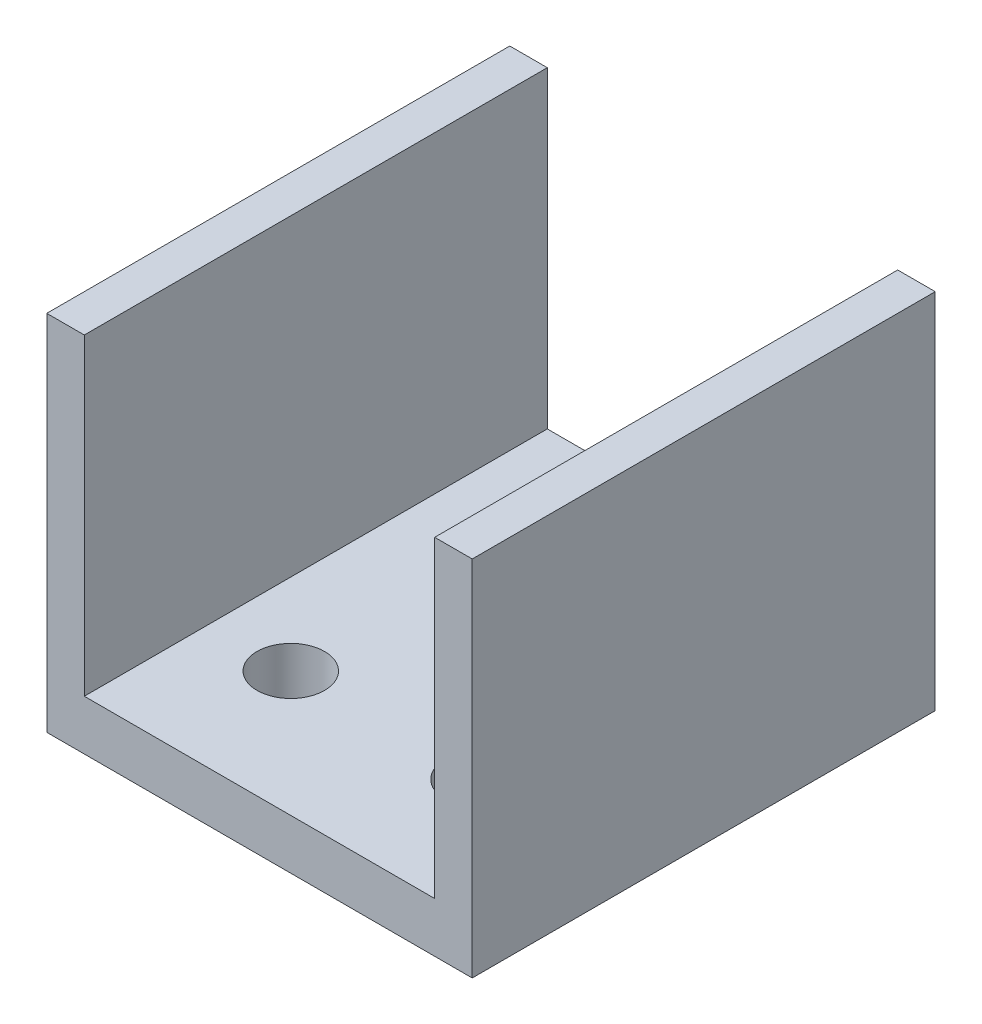
ISO-10303-21;
HEADER;
FILE_DESCRIPTION(('STEP AP214'),'2;1');
FILE_NAME('part.step','',(''),(''),'','','');
FILE_SCHEMA(('AUTOMOTIVE_DESIGN { 1 0 10303 214 1 1 1 1 }'));
ENDSEC;
DATA;
#1=APPLICATION_CONTEXT('core data for automotive mechanical design processes');
#2=APPLICATION_PROTOCOL_DEFINITION('international standard','automotive_design',2000,#1);
#3=PRODUCT_CONTEXT('',#1,'mechanical');
#4=PRODUCT('Part','Part','',(#3));
#5=PRODUCT_RELATED_PRODUCT_CATEGORY('part','',(#4));
#6=PRODUCT_DEFINITION_FORMATION('','',#4);
#7=PRODUCT_DEFINITION_CONTEXT('part definition',#1,'design');
#8=PRODUCT_DEFINITION('design','',#6,#7);
#9=PRODUCT_DEFINITION_SHAPE('','',#8);
#10=(LENGTH_UNIT() NAMED_UNIT(*) SI_UNIT(.MILLI.,.METRE.));
#11=(NAMED_UNIT(*) PLANE_ANGLE_UNIT() SI_UNIT($,.RADIAN.));
#12=(NAMED_UNIT(*) SI_UNIT($,.STERADIAN.) SOLID_ANGLE_UNIT());
#13=UNCERTAINTY_MEASURE_WITH_UNIT(LENGTH_MEASURE(1.E-05),#10,'distance_accuracy_value','');
#14=(GEOMETRIC_REPRESENTATION_CONTEXT(3) GLOBAL_UNCERTAINTY_ASSIGNED_CONTEXT((#13)) GLOBAL_UNIT_ASSIGNED_CONTEXT((#10,
#11,#12)) REPRESENTATION_CONTEXT('',''));
#15=CARTESIAN_POINT('',(0.,0.,0.));
#16=DIRECTION('',(0.,0.,1.));
#17=DIRECTION('',(1.,0.,0.));
#18=AXIS2_PLACEMENT_3D('',#15,#16,#17);
#19=CARTESIAN_POINT('',(0.,4.,0.));
#20=DIRECTION('',(0.,-1.,0.));
#21=DIRECTION('',(0.,0.,-1.));
#22=AXIS2_PLACEMENT_3D('',#19,#20,#21);
#23=PLANE('',#22);
#24=CARTESIAN_POINT('',(-26.3253908026687,4.,-0.924231459172718));
#25=DIRECTION('',(0.,1.,0.));
#26=DIRECTION('',(0.,0.,-1.));
#27=AXIS2_PLACEMENT_3D('',#24,#25,#26);
#28=CIRCLE('',#27,2.7);
#29=CARTESIAN_POINT('',(-26.3253908026687,4.,-3.62423145917272));
#30=VERTEX_POINT('',#29);
#31=EDGE_CURVE('E152',#30,#30,#28,.T.);
#32=ORIENTED_EDGE('',*,*,#31,.F.);
#33=EDGE_LOOP('',(#32));
#34=FACE_BOUND('',#33,.T.);
#35=CARTESIAN_POINT('',(-11.3253908026687,4.,-0.92423145917272));
#36=DIRECTION('',(0.,1.,0.));
#37=DIRECTION('',(0.,0.,1.));
#38=AXIS2_PLACEMENT_3D('',#35,#36,#37);
#39=CIRCLE('',#38,2.7);
#40=CARTESIAN_POINT('',(-11.3253908026687,4.,1.77576854082728));
#41=VERTEX_POINT('',#40);
#42=EDGE_CURVE('E158',#41,#41,#39,.T.);
#43=ORIENTED_EDGE('',*,*,#42,.F.);
#44=EDGE_LOOP('',(#43));
#45=FACE_BOUND('',#44,.T.);
#46=CARTESIAN_POINT('',(-18.8253908026687,4.,-20.9242314591727));
#47=DIRECTION('',(0.,1.,0.));
#48=DIRECTION('',(0.,0.,1.));
#49=AXIS2_PLACEMENT_3D('',#46,#47,#48);
#50=CIRCLE('',#49,2.7);
#51=CARTESIAN_POINT('',(-18.8253908026687,4.,-18.2242314591727));
#52=VERTEX_POINT('',#51);
#53=EDGE_CURVE('E164',#52,#52,#50,.T.);
#54=ORIENTED_EDGE('',*,*,#53,.F.);
#55=EDGE_LOOP('',(#54));
#56=FACE_BOUND('',#55,.T.);
#57=DIRECTION('',(0.,0.,-1.));
#58=VECTOR('',#57,1.);
#59=CARTESIAN_POINT('',(-4.82539080266867,4.,-27.9242314591727));
#60=LINE('',#59,#58);
#61=CARTESIAN_POINT('',(-4.82539080266867,4.,9.07576854082728));
#62=VERTEX_POINT('',#61);
#63=CARTESIAN_POINT('',(-4.82539080266867,4.,-27.9242314591727));
#64=VERTEX_POINT('',#63);
#65=EDGE_CURVE('E115',#62,#64,#60,.T.);
#66=ORIENTED_EDGE('',*,*,#65,.T.);
#67=DIRECTION('',(-1.,0.,0.));
#68=VECTOR('',#67,1.);
#69=CARTESIAN_POINT('',(-35.8253908026687,4.,-27.9242314591727));
#70=LINE('',#69,#68);
#71=CARTESIAN_POINT('',(-32.8253908026687,4.,-27.9242314591727));
#72=VERTEX_POINT('',#71);
#73=EDGE_CURVE('E127',#64,#72,#70,.T.);
#74=ORIENTED_EDGE('',*,*,#73,.T.);
#75=DIRECTION('',(0.,0.,1.));
#76=VECTOR('',#75,1.);
#77=CARTESIAN_POINT('',(-32.8253908026687,4.,9.07576854082728));
#78=LINE('',#77,#76);
#79=CARTESIAN_POINT('',(-32.8253908026687,4.,9.07576854082728));
#80=VERTEX_POINT('',#79);
#81=EDGE_CURVE('E141',#72,#80,#78,.T.);
#82=ORIENTED_EDGE('',*,*,#81,.T.);
#83=DIRECTION('',(1.,0.,0.));
#84=VECTOR('',#83,1.);
#85=CARTESIAN_POINT('',(-35.8253908026687,4.,9.07576854082728));
#86=LINE('',#85,#84);
#87=EDGE_CURVE('E50',#80,#62,#86,.T.);
#88=ORIENTED_EDGE('',*,*,#87,.T.);
#89=EDGE_LOOP('',(#66,#74,#82,#88));
#90=FACE_BOUND('',#89,.T.);
#91=ADVANCED_FACE('F35',(#34,#45,#56,#90),#23,.F.);
#92=CARTESIAN_POINT('',(0.,0.,0.));
#93=DIRECTION('',(0.,-1.,0.));
#94=DIRECTION('',(0.,0.,-1.));
#95=AXIS2_PLACEMENT_3D('',#92,#93,#94);
#96=PLANE('',#95);
#97=CARTESIAN_POINT('',(-11.3253908026687,0.,-0.92423145917272));
#98=DIRECTION('',(0.,1.,0.));
#99=DIRECTION('',(0.,0.,1.));
#100=AXIS2_PLACEMENT_3D('',#97,#98,#99);
#101=CIRCLE('',#100,2.7);
#102=CARTESIAN_POINT('',(-11.3253908026687,0.,1.77576854082728));
#103=VERTEX_POINT('',#102);
#104=EDGE_CURVE('E155',#103,#103,#101,.T.);
#105=ORIENTED_EDGE('',*,*,#104,.T.);
#106=EDGE_LOOP('',(#105));
#107=FACE_BOUND('',#106,.T.);
#108=DIRECTION('',(0.,0.,1.));
#109=VECTOR('',#108,1.);
#110=CARTESIAN_POINT('',(-35.8253908026687,0.,9.07576854082728));
#111=LINE('',#110,#109);
#112=CARTESIAN_POINT('',(-35.8253908026687,0.,-27.9242314591727));
#113=VERTEX_POINT('',#112);
#114=CARTESIAN_POINT('',(-35.8253908026687,0.,9.07576854082728));
#115=VERTEX_POINT('',#114);
#116=EDGE_CURVE('E167',#113,#115,#111,.T.);
#117=ORIENTED_EDGE('',*,*,#116,.F.);
#118=DIRECTION('',(-1.,0.,0.));
#119=VECTOR('',#118,1.);
#120=CARTESIAN_POINT('',(-35.8253908026687,0.,-27.9242314591727));
#121=LINE('',#120,#119);
#122=CARTESIAN_POINT('',(-1.82539080266867,0.,-27.9242314591727));
#123=VERTEX_POINT('',#122);
#124=EDGE_CURVE('E171',#123,#113,#121,.T.);
#125=ORIENTED_EDGE('',*,*,#124,.F.);
#126=DIRECTION('',(0.,0.,-1.));
#127=VECTOR('',#126,1.);
#128=CARTESIAN_POINT('',(-1.82539080266866,0.,9.07576854082728));
#129=LINE('',#128,#127);
#130=CARTESIAN_POINT('',(-1.82539080266866,0.,9.07576854082728));
#131=VERTEX_POINT('',#130);
#132=EDGE_CURVE('E178',#131,#123,#129,.T.);
#133=ORIENTED_EDGE('',*,*,#132,.F.);
#134=DIRECTION('',(1.,0.,0.));
#135=VECTOR('',#134,1.);
#136=CARTESIAN_POINT('',(-35.8253908026687,0.,9.07576854082728));
#137=LINE('',#136,#135);
#138=EDGE_CURVE('E176',#115,#131,#137,.T.);
#139=ORIENTED_EDGE('',*,*,#138,.F.);
#140=EDGE_LOOP('',(#117,#125,#133,#139));
#141=FACE_BOUND('',#140,.T.);
#142=CARTESIAN_POINT('',(-18.8253908026687,0.,-20.9242314591727));
#143=DIRECTION('',(0.,1.,0.));
#144=DIRECTION('',(0.,0.,1.));
#145=AXIS2_PLACEMENT_3D('',#142,#143,#144);
#146=CIRCLE('',#145,2.7);
#147=CARTESIAN_POINT('',(-18.8253908026687,0.,-18.2242314591727));
#148=VERTEX_POINT('',#147);
#149=EDGE_CURVE('E161',#148,#148,#146,.T.);
#150=ORIENTED_EDGE('',*,*,#149,.T.);
#151=EDGE_LOOP('',(#150));
#152=FACE_BOUND('',#151,.T.);
#153=CARTESIAN_POINT('',(-26.3253908026687,0.,-0.924231459172718));
#154=DIRECTION('',(0.,1.,0.));
#155=DIRECTION('',(0.,0.,-1.));
#156=AXIS2_PLACEMENT_3D('',#153,#154,#155);
#157=CIRCLE('',#156,2.7);
#158=CARTESIAN_POINT('',(-26.3253908026687,0.,-3.62423145917272));
#159=VERTEX_POINT('',#158);
#160=EDGE_CURVE('E149',#159,#159,#157,.T.);
#161=ORIENTED_EDGE('',*,*,#160,.T.);
#162=EDGE_LOOP('',(#161));
#163=FACE_BOUND('',#162,.T.);
#164=ADVANCED_FACE('F192',(#107,#141,#152,#163),#96,.T.);
#165=CARTESIAN_POINT('',(-35.8253908026687,4.,9.07576854082728));
#166=DIRECTION('',(1.,0.,0.));
#167=DIRECTION('',(0.,0.,-1.));
#168=AXIS2_PLACEMENT_3D('',#165,#166,#167);
#169=PLANE('',#168);
#170=ORIENTED_EDGE('',*,*,#116,.T.);
#171=DIRECTION('',(0.,-1.,0.));
#172=VECTOR('',#171,1.);
#173=CARTESIAN_POINT('',(-35.8253908026687,4.,9.07576854082728));
#174=LINE('',#173,#172);
#175=CARTESIAN_POINT('',(-35.8253908026687,29.,9.07576854082728));
#176=VERTEX_POINT('',#175);
#177=EDGE_CURVE('E11',#176,#115,#174,.T.);
#178=ORIENTED_EDGE('',*,*,#177,.F.);
#179=DIRECTION('',(0.,0.,-1.));
#180=VECTOR('',#179,1.);
#181=CARTESIAN_POINT('',(-35.8253908026687,29.,9.07576854082728));
#182=LINE('',#181,#180);
#183=CARTESIAN_POINT('',(-35.8253908026687,29.,-27.9242314591727));
#184=VERTEX_POINT('',#183);
#185=EDGE_CURVE('E133',#176,#184,#182,.T.);
#186=ORIENTED_EDGE('',*,*,#185,.T.);
#187=DIRECTION('',(0.,-1.,0.));
#188=VECTOR('',#187,1.);
#189=CARTESIAN_POINT('',(-35.8253908026687,4.,-27.9242314591727));
#190=LINE('',#189,#188);
#191=EDGE_CURVE('E173',#184,#113,#190,.T.);
#192=ORIENTED_EDGE('',*,*,#191,.T.);
#193=EDGE_LOOP('',(#170,#178,#186,#192));
#194=FACE_BOUND('',#193,.T.);
#195=ADVANCED_FACE('F37',(#194),#169,.F.);
#196=CARTESIAN_POINT('',(-35.8253908026687,4.,9.07576854082728));
#197=DIRECTION('',(0.,0.,-1.));
#198=DIRECTION('',(-1.,0.,0.));
#199=AXIS2_PLACEMENT_3D('',#196,#197,#198);
#200=PLANE('',#199);
#201=ORIENTED_EDGE('',*,*,#138,.T.);
#202=DIRECTION('',(0.,-1.,0.));
#203=VECTOR('',#202,1.);
#204=CARTESIAN_POINT('',(-1.82539080266866,4.,9.07576854082728));
#205=LINE('',#204,#203);
#206=CARTESIAN_POINT('',(-1.82539080266866,29.,9.07576854082727));
#207=VERTEX_POINT('',#206);
#208=EDGE_CURVE('E43',#207,#131,#205,.T.);
#209=ORIENTED_EDGE('',*,*,#208,.F.);
#210=DIRECTION('',(1.,0.,0.));
#211=VECTOR('',#210,1.);
#212=CARTESIAN_POINT('',(-4.82539080266866,29.,9.07576854082727));
#213=LINE('',#212,#211);
#214=CARTESIAN_POINT('',(-4.82539080266866,29.,9.07576854082727));
#215=VERTEX_POINT('',#214);
#216=EDGE_CURVE('E114',#215,#207,#213,.T.);
#217=ORIENTED_EDGE('',*,*,#216,.F.);
#218=DIRECTION('',(0.,-1.,0.));
#219=VECTOR('',#218,1.);
#220=CARTESIAN_POINT('',(-4.82539080266866,4.,9.07576854082727));
#221=LINE('',#220,#219);
#222=EDGE_CURVE('E123',#215,#62,#221,.T.);
#223=ORIENTED_EDGE('',*,*,#222,.T.);
#224=ORIENTED_EDGE('',*,*,#87,.F.);
#225=DIRECTION('',(0.,1.,0.));
#226=VECTOR('',#225,1.);
#227=CARTESIAN_POINT('',(-32.8253908026687,4.,9.07576854082728));
#228=LINE('',#227,#226);
#229=CARTESIAN_POINT('',(-32.8253908026687,29.,9.07576854082728));
#230=VERTEX_POINT('',#229);
#231=EDGE_CURVE('E58',#80,#230,#228,.T.);
#232=ORIENTED_EDGE('',*,*,#231,.T.);
#233=DIRECTION('',(-1.,0.,0.));
#234=VECTOR('',#233,1.);
#235=CARTESIAN_POINT('',(-32.8253908026687,29.,9.07576854082728));
#236=LINE('',#235,#234);
#237=EDGE_CURVE('E143',#230,#176,#236,.T.);
#238=ORIENTED_EDGE('',*,*,#237,.T.);
#239=ORIENTED_EDGE('',*,*,#177,.T.);
#240=EDGE_LOOP('',(#201,#209,#217,#223,#224,#232,#238,#239));
#241=FACE_BOUND('',#240,.T.);
#242=ADVANCED_FACE('F200',(#241),#200,.F.);
#243=CARTESIAN_POINT('',(-1.82539080266866,4.,9.07576854082728));
#244=DIRECTION('',(-1.,0.,0.));
#245=DIRECTION('',(0.,0.,1.));
#246=AXIS2_PLACEMENT_3D('',#243,#244,#245);
#247=PLANE('',#246);
#248=ORIENTED_EDGE('',*,*,#132,.T.);
#249=DIRECTION('',(0.,-1.,0.));
#250=VECTOR('',#249,1.);
#251=CARTESIAN_POINT('',(-1.82539080266867,4.,-27.9242314591727));
#252=LINE('',#251,#250);
#253=CARTESIAN_POINT('',(-1.82539080266867,29.,-27.9242314591727));
#254=VERTEX_POINT('',#253);
#255=EDGE_CURVE('E183',#254,#123,#252,.T.);
#256=ORIENTED_EDGE('',*,*,#255,.F.);
#257=DIRECTION('',(0.,0.,1.));
#258=VECTOR('',#257,1.);
#259=CARTESIAN_POINT('',(-1.82539080266867,29.,-27.9242314591727));
#260=LINE('',#259,#258);
#261=EDGE_CURVE('E110',#254,#207,#260,.T.);
#262=ORIENTED_EDGE('',*,*,#261,.T.);
#263=ORIENTED_EDGE('',*,*,#208,.T.);
#264=EDGE_LOOP('',(#248,#256,#262,#263));
#265=FACE_BOUND('',#264,.T.);
#266=ADVANCED_FACE('F187',(#265),#247,.F.);
#267=CARTESIAN_POINT('',(-35.8253908026687,4.,-27.9242314591727));
#268=DIRECTION('',(0.,0.,1.));
#269=DIRECTION('',(1.,0.,0.));
#270=AXIS2_PLACEMENT_3D('',#267,#268,#269);
#271=PLANE('',#270);
#272=ORIENTED_EDGE('',*,*,#124,.T.);
#273=ORIENTED_EDGE('',*,*,#191,.F.);
#274=DIRECTION('',(-1.,0.,0.));
#275=VECTOR('',#274,1.);
#276=CARTESIAN_POINT('',(-32.8253908026687,29.,-27.9242314591727));
#277=LINE('',#276,#275);
#278=CARTESIAN_POINT('',(-32.8253908026687,29.,-27.9242314591727));
#279=VERTEX_POINT('',#278);
#280=EDGE_CURVE('E146',#279,#184,#277,.T.);
#281=ORIENTED_EDGE('',*,*,#280,.F.);
#282=DIRECTION('',(0.,-1.,0.));
#283=VECTOR('',#282,1.);
#284=CARTESIAN_POINT('',(-32.8253908026687,4.,-27.9242314591727));
#285=LINE('',#284,#283);
#286=EDGE_CURVE('E139',#279,#72,#285,.T.);
#287=ORIENTED_EDGE('',*,*,#286,.T.);
#288=ORIENTED_EDGE('',*,*,#73,.F.);
#289=DIRECTION('',(0.,1.,0.));
#290=VECTOR('',#289,1.);
#291=CARTESIAN_POINT('',(-4.82539080266867,4.,-27.9242314591727));
#292=LINE('',#291,#290);
#293=CARTESIAN_POINT('',(-4.82539080266867,29.,-27.9242314591727));
#294=VERTEX_POINT('',#293);
#295=EDGE_CURVE('E122',#64,#294,#292,.T.);
#296=ORIENTED_EDGE('',*,*,#295,.T.);
#297=DIRECTION('',(1.,0.,0.));
#298=VECTOR('',#297,1.);
#299=CARTESIAN_POINT('',(-4.82539080266867,29.,-27.9242314591727));
#300=LINE('',#299,#298);
#301=EDGE_CURVE('E104',#294,#254,#300,.T.);
#302=ORIENTED_EDGE('',*,*,#301,.T.);
#303=ORIENTED_EDGE('',*,*,#255,.T.);
#304=EDGE_LOOP('',(#272,#273,#281,#287,#288,#296,#302,#303));
#305=FACE_BOUND('',#304,.T.);
#306=ADVANCED_FACE('F125',(#305),#271,.F.);
#307=CARTESIAN_POINT('',(-18.8253908026687,4.,-20.9242314591727));
#308=DIRECTION('',(0.,-1.,0.));
#309=DIRECTION('',(0.,0.,-1.));
#310=AXIS2_PLACEMENT_3D('',#307,#308,#309);
#311=CYLINDRICAL_SURFACE('',#310,2.7);
#312=ORIENTED_EDGE('',*,*,#53,.T.);
#313=EDGE_LOOP('',(#312));
#314=FACE_BOUND('',#313,.T.);
#315=ORIENTED_EDGE('',*,*,#149,.F.);
#316=EDGE_LOOP('',(#315));
#317=FACE_BOUND('',#316,.T.);
#318=ADVANCED_FACE('F218',(#314,#317),#311,.F.);
#319=CARTESIAN_POINT('',(-11.3253908026687,4.,-0.92423145917272));
#320=DIRECTION('',(0.,-1.,0.));
#321=DIRECTION('',(0.,0.,-1.));
#322=AXIS2_PLACEMENT_3D('',#319,#320,#321);
#323=CYLINDRICAL_SURFACE('',#322,2.7);
#324=ORIENTED_EDGE('',*,*,#42,.T.);
#325=EDGE_LOOP('',(#324));
#326=FACE_BOUND('',#325,.T.);
#327=ORIENTED_EDGE('',*,*,#104,.F.);
#328=EDGE_LOOP('',(#327));
#329=FACE_BOUND('',#328,.T.);
#330=ADVANCED_FACE('F225',(#326,#329),#323,.F.);
#331=CARTESIAN_POINT('',(-26.3253908026687,4.,-0.924231459172718));
#332=DIRECTION('',(0.,-1.,0.));
#333=DIRECTION('',(0.,0.,-1.));
#334=AXIS2_PLACEMENT_3D('',#331,#332,#333);
#335=CYLINDRICAL_SURFACE('',#334,2.7);
#336=ORIENTED_EDGE('',*,*,#31,.T.);
#337=EDGE_LOOP('',(#336));
#338=FACE_BOUND('',#337,.T.);
#339=ORIENTED_EDGE('',*,*,#160,.F.);
#340=EDGE_LOOP('',(#339));
#341=FACE_BOUND('',#340,.T.);
#342=ADVANCED_FACE('F230',(#338,#341),#335,.F.);
#343=CARTESIAN_POINT('',(-32.8253908026687,29.,9.07576854082728));
#344=DIRECTION('',(0.,1.,0.));
#345=DIRECTION('',(0.,0.,1.));
#346=AXIS2_PLACEMENT_3D('',#343,#344,#345);
#347=PLANE('',#346);
#348=ORIENTED_EDGE('',*,*,#185,.F.);
#349=ORIENTED_EDGE('',*,*,#237,.F.);
#350=DIRECTION('',(0.,0.,-1.));
#351=VECTOR('',#350,1.);
#352=CARTESIAN_POINT('',(-32.8253908026687,29.,9.07576854082728));
#353=LINE('',#352,#351);
#354=EDGE_CURVE('E136',#230,#279,#353,.T.);
#355=ORIENTED_EDGE('',*,*,#354,.T.);
#356=ORIENTED_EDGE('',*,*,#280,.T.);
#357=EDGE_LOOP('',(#348,#349,#355,#356));
#358=FACE_BOUND('',#357,.T.);
#359=ADVANCED_FACE('F197',(#358),#347,.T.);
#360=CARTESIAN_POINT('',(-32.8253908026687,0.,0.));
#361=DIRECTION('',(-1.,0.,0.));
#362=DIRECTION('',(0.,0.,1.));
#363=AXIS2_PLACEMENT_3D('',#360,#361,#362);
#364=PLANE('',#363);
#365=ORIENTED_EDGE('',*,*,#231,.F.);
#366=ORIENTED_EDGE('',*,*,#81,.F.);
#367=ORIENTED_EDGE('',*,*,#286,.F.);
#368=ORIENTED_EDGE('',*,*,#354,.F.);
#369=EDGE_LOOP('',(#365,#366,#367,#368));
#370=FACE_BOUND('',#369,.T.);
#371=ADVANCED_FACE('F199',(#370),#364,.F.);
#372=CARTESIAN_POINT('',(-4.82539080266867,29.,-27.9242314591727));
#373=DIRECTION('',(0.,1.,0.));
#374=DIRECTION('',(0.,0.,1.));
#375=AXIS2_PLACEMENT_3D('',#372,#373,#374);
#376=PLANE('',#375);
#377=ORIENTED_EDGE('',*,*,#261,.F.);
#378=ORIENTED_EDGE('',*,*,#301,.F.);
#379=DIRECTION('',(0.,0.,1.));
#380=VECTOR('',#379,1.);
#381=CARTESIAN_POINT('',(-4.82539080266867,29.,-27.9242314591727));
#382=LINE('',#381,#380);
#383=EDGE_CURVE('E108',#294,#215,#382,.T.);
#384=ORIENTED_EDGE('',*,*,#383,.T.);
#385=ORIENTED_EDGE('',*,*,#216,.T.);
#386=EDGE_LOOP('',(#377,#378,#384,#385));
#387=FACE_BOUND('',#386,.T.);
#388=ADVANCED_FACE('F106',(#387),#376,.T.);
#389=CARTESIAN_POINT('',(-4.82539080266867,0.,0.));
#390=DIRECTION('',(1.,0.,0.));
#391=DIRECTION('',(0.,0.,-1.));
#392=AXIS2_PLACEMENT_3D('',#389,#390,#391);
#393=PLANE('',#392);
#394=ORIENTED_EDGE('',*,*,#295,.F.);
#395=ORIENTED_EDGE('',*,*,#65,.F.);
#396=ORIENTED_EDGE('',*,*,#222,.F.);
#397=ORIENTED_EDGE('',*,*,#383,.F.);
#398=EDGE_LOOP('',(#394,#395,#396,#397));
#399=FACE_BOUND('',#398,.T.);
#400=ADVANCED_FACE('F120',(#399),#393,.F.);
#401=CLOSED_SHELL('',(#91,#164,#195,#242,#266,#306,#318,#330,#342,#359,#371,#388,#400));
#402=MANIFOLD_SOLID_BREP('B2',#401);
#403=ADVANCED_BREP_SHAPE_REPRESENTATION('',(#18,#402),#14);
#404=SHAPE_DEFINITION_REPRESENTATION(#9,#403);
ENDSEC;
END-ISO-10303-21;
